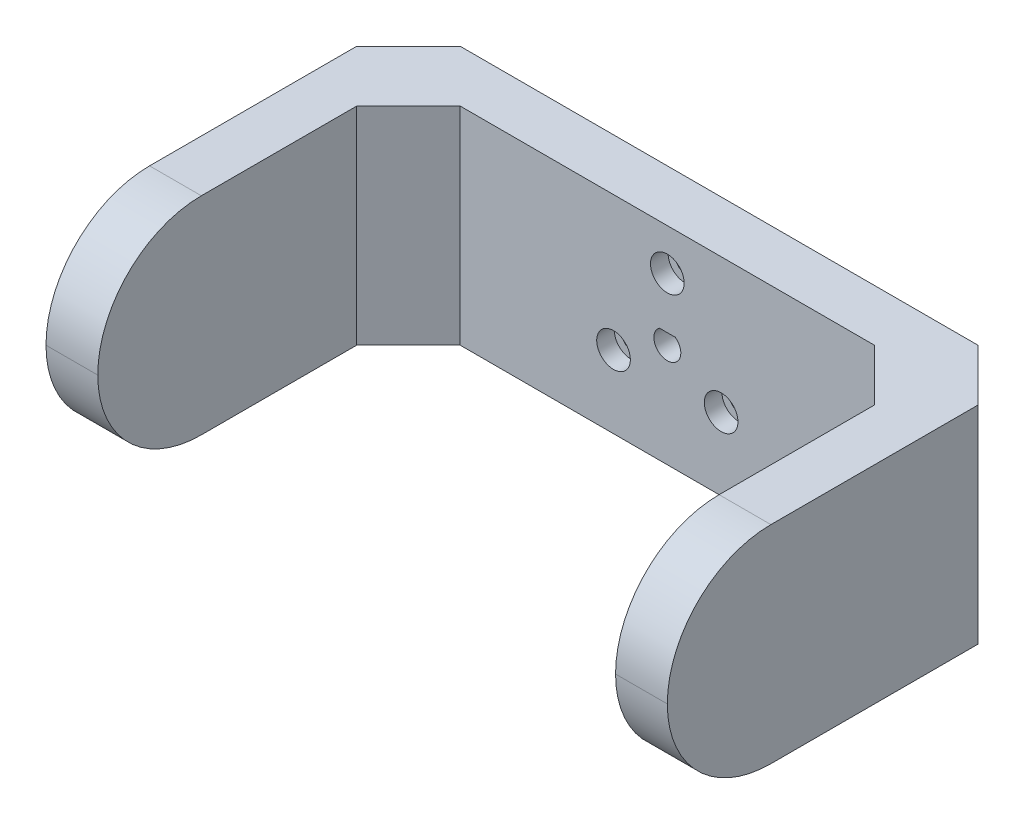
ISO-10303-21;
HEADER;
FILE_DESCRIPTION(('STEP AP214'),'2;1');
FILE_NAME('part.step','',(''),(''),'','','');
FILE_SCHEMA(('AUTOMOTIVE_DESIGN { 1 0 10303 214 1 1 1 1 }'));
ENDSEC;
DATA;
#1=APPLICATION_CONTEXT('core data for automotive mechanical design processes');
#2=APPLICATION_PROTOCOL_DEFINITION('international standard','automotive_design',2000,#1);
#3=PRODUCT_CONTEXT('',#1,'mechanical');
#4=PRODUCT('Part','Part','',(#3));
#5=PRODUCT_RELATED_PRODUCT_CATEGORY('part','',(#4));
#6=PRODUCT_DEFINITION_FORMATION('','',#4);
#7=PRODUCT_DEFINITION_CONTEXT('part definition',#1,'design');
#8=PRODUCT_DEFINITION('design','',#6,#7);
#9=PRODUCT_DEFINITION_SHAPE('','',#8);
#10=(LENGTH_UNIT() NAMED_UNIT(*) SI_UNIT(.MILLI.,.METRE.));
#11=(NAMED_UNIT(*) PLANE_ANGLE_UNIT() SI_UNIT($,.RADIAN.));
#12=(NAMED_UNIT(*) SI_UNIT($,.STERADIAN.) SOLID_ANGLE_UNIT());
#13=UNCERTAINTY_MEASURE_WITH_UNIT(LENGTH_MEASURE(1.E-05),#10,'distance_accuracy_value','');
#14=(GEOMETRIC_REPRESENTATION_CONTEXT(3) GLOBAL_UNCERTAINTY_ASSIGNED_CONTEXT((#13)) GLOBAL_UNIT_ASSIGNED_CONTEXT((#10,
#11,#12)) REPRESENTATION_CONTEXT('',''));
#15=CARTESIAN_POINT('',(0.,0.,0.));
#16=DIRECTION('',(0.,0.,1.));
#17=DIRECTION('',(1.,0.,0.));
#18=AXIS2_PLACEMENT_3D('',#15,#16,#17);
#19=CARTESIAN_POINT('',(-60.,20.,0.));
#20=DIRECTION('',(1.,0.,0.));
#21=DIRECTION('',(0.,0.,-1.));
#22=AXIS2_PLACEMENT_3D('',#19,#20,#21);
#23=PLANE('',#22);
#24=DIRECTION('',(0.,0.,1.));
#25=VECTOR('',#24,1.);
#26=CARTESIAN_POINT('',(-60.,-20.,0.));
#27=LINE('',#26,#25);
#28=CARTESIAN_POINT('',(-60.,-20.,9.99999999999996));
#29=VERTEX_POINT('',#28);
#30=CARTESIAN_POINT('',(-60.,-20.,50.));
#31=VERTEX_POINT('',#30);
#32=EDGE_CURVE('E187',#29,#31,#27,.T.);
#33=ORIENTED_EDGE('',*,*,#32,.T.);
#34=CARTESIAN_POINT('',(-60.,0.,50.));
#35=DIRECTION('',(1.,0.,0.));
#36=DIRECTION('',(0.,0.,-1.));
#37=AXIS2_PLACEMENT_3D('',#34,#35,#36);
#38=CIRCLE('',#37,20.);
#39=CARTESIAN_POINT('',(-60.,0.,70.));
#40=VERTEX_POINT('',#39);
#41=EDGE_CURVE('E269',#31,#40,#38,.F.);
#42=ORIENTED_EDGE('',*,*,#41,.T.);
#43=CARTESIAN_POINT('',(-60.,0.,50.));
#44=DIRECTION('',(1.,0.,0.));
#45=DIRECTION('',(0.,0.,-1.));
#46=AXIS2_PLACEMENT_3D('',#43,#44,#45);
#47=CIRCLE('',#46,20.);
#48=CARTESIAN_POINT('',(-60.,20.,50.));
#49=VERTEX_POINT('',#48);
#50=EDGE_CURVE('E267',#40,#49,#47,.F.);
#51=ORIENTED_EDGE('',*,*,#50,.T.);
#52=DIRECTION('',(0.,0.,1.));
#53=VECTOR('',#52,1.);
#54=CARTESIAN_POINT('',(-60.,20.,0.));
#55=LINE('',#54,#53);
#56=CARTESIAN_POINT('',(-60.,20.,9.99999999999996));
#57=VERTEX_POINT('',#56);
#58=EDGE_CURVE('E188',#57,#49,#55,.T.);
#59=ORIENTED_EDGE('',*,*,#58,.F.);
#60=DIRECTION('',(0.,-1.,0.));
#61=VECTOR('',#60,1.);
#62=CARTESIAN_POINT('',(-60.,20.,9.99999999999996));
#63=LINE('',#62,#61);
#64=EDGE_CURVE('E243',#57,#29,#63,.T.);
#65=ORIENTED_EDGE('',*,*,#64,.T.);
#66=EDGE_LOOP('',(#33,#42,#51,#59,#65));
#67=FACE_BOUND('',#66,.T.);
#68=ADVANCED_FACE('F43',(#67),#23,.F.);
#69=CARTESIAN_POINT('',(-50.,20.,70.));
#70=DIRECTION('',(-1.,0.,0.));
#71=DIRECTION('',(0.,0.,1.));
#72=AXIS2_PLACEMENT_3D('',#69,#70,#71);
#73=PLANE('',#72);
#74=CARTESIAN_POINT('',(-50.,0.,50.));
#75=DIRECTION('',(-1.,0.,0.));
#76=DIRECTION('',(0.,0.,1.));
#77=AXIS2_PLACEMENT_3D('',#74,#75,#76);
#78=CIRCLE('',#77,20.);
#79=CARTESIAN_POINT('',(-50.,20.,50.));
#80=VERTEX_POINT('',#79);
#81=CARTESIAN_POINT('',(-50.,0.,70.));
#82=VERTEX_POINT('',#81);
#83=EDGE_CURVE('E258',#80,#82,#78,.F.);
#84=ORIENTED_EDGE('',*,*,#83,.T.);
#85=CARTESIAN_POINT('',(-50.,0.,50.));
#86=DIRECTION('',(-1.,0.,0.));
#87=DIRECTION('',(0.,0.,1.));
#88=AXIS2_PLACEMENT_3D('',#85,#86,#87);
#89=CIRCLE('',#88,20.);
#90=CARTESIAN_POINT('',(-50.,-20.,50.));
#91=VERTEX_POINT('',#90);
#92=EDGE_CURVE('E260',#82,#91,#89,.F.);
#93=ORIENTED_EDGE('',*,*,#92,.T.);
#94=DIRECTION('',(0.,0.,-1.));
#95=VECTOR('',#94,1.);
#96=CARTESIAN_POINT('',(-50.,-20.,70.));
#97=LINE('',#96,#95);
#98=CARTESIAN_POINT('',(-50.,-20.,20.));
#99=VERTEX_POINT('',#98);
#100=EDGE_CURVE('E208',#91,#99,#97,.T.);
#101=ORIENTED_EDGE('',*,*,#100,.T.);
#102=DIRECTION('',(0.,1.,0.));
#103=VECTOR('',#102,1.);
#104=CARTESIAN_POINT('',(-50.,20.,20.));
#105=LINE('',#104,#103);
#106=CARTESIAN_POINT('',(-50.,20.,20.));
#107=VERTEX_POINT('',#106);
#108=EDGE_CURVE('E246',#99,#107,#105,.T.);
#109=ORIENTED_EDGE('',*,*,#108,.T.);
#110=DIRECTION('',(0.,0.,-1.));
#111=VECTOR('',#110,1.);
#112=CARTESIAN_POINT('',(-50.,20.,70.));
#113=LINE('',#112,#111);
#114=EDGE_CURVE('E191',#80,#107,#113,.T.);
#115=ORIENTED_EDGE('',*,*,#114,.F.);
#116=EDGE_LOOP('',(#84,#93,#101,#109,#115));
#117=FACE_BOUND('',#116,.T.);
#118=ADVANCED_FACE('F328',(#117),#73,.F.);
#119=CARTESIAN_POINT('',(-50.,20.,10.));
#120=DIRECTION('',(0.,0.,-1.));
#121=DIRECTION('',(-1.,0.,0.));
#122=AXIS2_PLACEMENT_3D('',#119,#120,#121);
#123=PLANE('',#122);
#124=CARTESIAN_POINT('',(10.3923048454131,-5.99999999999967,9.99999999999999));
#125=DIRECTION('',(0.,0.,1.));
#126=DIRECTION('',(-0.500000000000004,-0.866025403784436,0.));
#127=AXIS2_PLACEMENT_3D('',#124,#125,#126);
#128=CIRCLE('',#127,3.25);
#129=CARTESIAN_POINT('',(8.76730484541312,-8.81458256229909,9.99999999999999));
#130=VERTEX_POINT('',#129);
#131=EDGE_CURVE('E607',#130,#130,#128,.T.);
#132=ORIENTED_EDGE('',*,*,#131,.F.);
#133=EDGE_LOOP('',(#132));
#134=FACE_BOUND('',#133,.T.);
#135=CARTESIAN_POINT('',(-10.3923048454129,-6.,9.99999999999999));
#136=DIRECTION('',(0.,0.,1.));
#137=DIRECTION('',(-0.499999999999992,0.866025403784443,0.));
#138=AXIS2_PLACEMENT_3D('',#135,#136,#137);
#139=CIRCLE('',#138,3.25);
#140=CARTESIAN_POINT('',(-12.0173048454129,-3.18541743770056,9.99999999999999));
#141=VERTEX_POINT('',#140);
#142=EDGE_CURVE('E601',#141,#141,#139,.T.);
#143=ORIENTED_EDGE('',*,*,#142,.F.);
#144=EDGE_LOOP('',(#143));
#145=FACE_BOUND('',#144,.T.);
#146=CARTESIAN_POINT('',(-2.75821032680312E-13,11.9999999999997,9.99999999999999));
#147=DIRECTION('',(0.,0.,1.));
#148=DIRECTION('',(1.,0.,0.));
#149=AXIS2_PLACEMENT_3D('',#146,#147,#148);
#150=CIRCLE('',#149,3.25);
#151=CARTESIAN_POINT('',(3.24999999999972,11.9999999999997,9.99999999999999));
#152=VERTEX_POINT('',#151);
#153=EDGE_CURVE('E181',#152,#152,#150,.T.);
#154=ORIENTED_EDGE('',*,*,#153,.F.);
#155=EDGE_LOOP('',(#154));
#156=FACE_BOUND('',#155,.T.);
#157=DIRECTION('',(1.,0.,0.));
#158=VECTOR('',#157,1.);
#159=CARTESIAN_POINT('',(-50.,2.09999999999972,10.));
#160=LINE('',#159,#158);
#161=CARTESIAN_POINT('',(-1.53297097167531,2.09999999999972,9.99999999999999));
#162=VERTEX_POINT('',#161);
#163=CARTESIAN_POINT('',(1.53297097167531,2.09999999999972,9.99999999999999));
#164=VERTEX_POINT('',#163);
#165=EDGE_CURVE('E167',#162,#164,#160,.T.);
#166=ORIENTED_EDGE('',*,*,#165,.T.);
#167=CARTESIAN_POINT('',(-2.75821032680312E-13,-2.80157841370254E-13,9.99999999999999));
#168=DIRECTION('',(0.,0.,-1.));
#169=DIRECTION('',(-1.,0.,0.));
#170=AXIS2_PLACEMENT_3D('',#167,#168,#169);
#171=CIRCLE('',#170,2.59999999999984);
#172=EDGE_CURVE('E164',#164,#162,#171,.T.);
#173=ORIENTED_EDGE('',*,*,#172,.T.);
#174=EDGE_LOOP('',(#166,#173));
#175=FACE_BOUND('',#174,.T.);
#176=DIRECTION('',(1.,0.,0.));
#177=VECTOR('',#176,1.);
#178=CARTESIAN_POINT('',(-50.,-20.,10.));
#179=LINE('',#178,#177);
#180=CARTESIAN_POINT('',(-39.9999999999999,-20.,10.));
#181=VERTEX_POINT('',#180);
#182=CARTESIAN_POINT('',(40.,-20.,9.99999999999999));
#183=VERTEX_POINT('',#182);
#184=EDGE_CURVE('E210',#181,#183,#179,.T.);
#185=ORIENTED_EDGE('',*,*,#184,.T.);
#186=DIRECTION('',(0.,1.,0.));
#187=VECTOR('',#186,1.);
#188=CARTESIAN_POINT('',(40.,20.,9.99999999999999));
#189=LINE('',#188,#187);
#190=CARTESIAN_POINT('',(40.,20.,9.99999999999999));
#191=VERTEX_POINT('',#190);
#192=EDGE_CURVE('E241',#183,#191,#189,.T.);
#193=ORIENTED_EDGE('',*,*,#192,.T.);
#194=DIRECTION('',(1.,0.,0.));
#195=VECTOR('',#194,1.);
#196=CARTESIAN_POINT('',(-50.,20.,10.));
#197=LINE('',#196,#195);
#198=CARTESIAN_POINT('',(-39.9999999999999,20.,10.));
#199=VERTEX_POINT('',#198);
#200=EDGE_CURVE('E194',#199,#191,#197,.T.);
#201=ORIENTED_EDGE('',*,*,#200,.F.);
#202=DIRECTION('',(0.,-1.,0.));
#203=VECTOR('',#202,1.);
#204=CARTESIAN_POINT('',(-39.9999999999999,-20.,10.));
#205=LINE('',#204,#203);
#206=EDGE_CURVE('E238',#199,#181,#205,.T.);
#207=ORIENTED_EDGE('',*,*,#206,.T.);
#208=EDGE_LOOP('',(#185,#193,#201,#207));
#209=FACE_BOUND('',#208,.T.);
#210=ADVANCED_FACE('F307',(#134,#145,#156,#175,#209),#123,.F.);
#211=CARTESIAN_POINT('',(50.,20.,9.99999999999999));
#212=DIRECTION('',(1.,0.,0.));
#213=DIRECTION('',(0.,0.,-1.));
#214=AXIS2_PLACEMENT_3D('',#211,#212,#213);
#215=PLANE('',#214);
#216=CARTESIAN_POINT('',(50.,0.,50.));
#217=DIRECTION('',(1.,0.,0.));
#218=DIRECTION('',(0.,0.,-1.));
#219=AXIS2_PLACEMENT_3D('',#216,#217,#218);
#220=CIRCLE('',#219,20.);
#221=CARTESIAN_POINT('',(50.,-20.,50.));
#222=VERTEX_POINT('',#221);
#223=CARTESIAN_POINT('',(50.,0.,70.));
#224=VERTEX_POINT('',#223);
#225=EDGE_CURVE('E52',#222,#224,#220,.F.);
#226=ORIENTED_EDGE('',*,*,#225,.T.);
#227=CARTESIAN_POINT('',(50.,0.,50.));
#228=DIRECTION('',(1.,0.,0.));
#229=DIRECTION('',(0.,0.,-1.));
#230=AXIS2_PLACEMENT_3D('',#227,#228,#229);
#231=CIRCLE('',#230,20.);
#232=CARTESIAN_POINT('',(50.,20.,50.));
#233=VERTEX_POINT('',#232);
#234=EDGE_CURVE('E11',#224,#233,#231,.F.);
#235=ORIENTED_EDGE('',*,*,#234,.T.);
#236=DIRECTION('',(0.,0.,1.));
#237=VECTOR('',#236,1.);
#238=CARTESIAN_POINT('',(50.,20.,9.99999999999999));
#239=LINE('',#238,#237);
#240=CARTESIAN_POINT('',(50.,20.,20.0000000000001));
#241=VERTEX_POINT('',#240);
#242=EDGE_CURVE('E197',#241,#233,#239,.T.);
#243=ORIENTED_EDGE('',*,*,#242,.F.);
#244=DIRECTION('',(0.,-1.,0.));
#245=VECTOR('',#244,1.);
#246=CARTESIAN_POINT('',(50.,-20.,20.0000000000001));
#247=LINE('',#246,#245);
#248=CARTESIAN_POINT('',(50.,-20.,20.0000000000001));
#249=VERTEX_POINT('',#248);
#250=EDGE_CURVE('E235',#241,#249,#247,.T.);
#251=ORIENTED_EDGE('',*,*,#250,.T.);
#252=DIRECTION('',(0.,0.,1.));
#253=VECTOR('',#252,1.);
#254=CARTESIAN_POINT('',(50.,-20.,9.99999999999999));
#255=LINE('',#254,#253);
#256=EDGE_CURVE('E213',#249,#222,#255,.T.);
#257=ORIENTED_EDGE('',*,*,#256,.T.);
#258=EDGE_LOOP('',(#226,#235,#243,#251,#257));
#259=FACE_BOUND('',#258,.T.);
#260=ADVANCED_FACE('F296',(#259),#215,.F.);
#261=CARTESIAN_POINT('',(60.,20.,70.));
#262=DIRECTION('',(-1.,0.,0.));
#263=DIRECTION('',(0.,0.,1.));
#264=AXIS2_PLACEMENT_3D('',#261,#262,#263);
#265=PLANE('',#264);
#266=DIRECTION('',(0.,0.,-1.));
#267=VECTOR('',#266,1.);
#268=CARTESIAN_POINT('',(60.,20.,70.));
#269=LINE('',#268,#267);
#270=CARTESIAN_POINT('',(60.,20.,50.));
#271=VERTEX_POINT('',#270);
#272=CARTESIAN_POINT('',(60.,20.,10.));
#273=VERTEX_POINT('',#272);
#274=EDGE_CURVE('E200',#271,#273,#269,.T.);
#275=ORIENTED_EDGE('',*,*,#274,.F.);
#276=CARTESIAN_POINT('',(60.,0.,50.));
#277=DIRECTION('',(-1.,0.,0.));
#278=DIRECTION('',(0.,0.,1.));
#279=AXIS2_PLACEMENT_3D('',#276,#277,#278);
#280=CIRCLE('',#279,20.);
#281=CARTESIAN_POINT('',(60.,0.,70.));
#282=VERTEX_POINT('',#281);
#283=EDGE_CURVE('E66',#271,#282,#280,.F.);
#284=ORIENTED_EDGE('',*,*,#283,.T.);
#285=CARTESIAN_POINT('',(60.,0.,50.));
#286=DIRECTION('',(-1.,0.,0.));
#287=DIRECTION('',(0.,0.,1.));
#288=AXIS2_PLACEMENT_3D('',#285,#286,#287);
#289=CIRCLE('',#288,20.);
#290=CARTESIAN_POINT('',(60.,-20.,50.));
#291=VERTEX_POINT('',#290);
#292=EDGE_CURVE('E276',#282,#291,#289,.F.);
#293=ORIENTED_EDGE('',*,*,#292,.T.);
#294=DIRECTION('',(0.,0.,-1.));
#295=VECTOR('',#294,1.);
#296=CARTESIAN_POINT('',(60.,-20.,70.));
#297=LINE('',#296,#295);
#298=CARTESIAN_POINT('',(60.,-20.,10.));
#299=VERTEX_POINT('',#298);
#300=EDGE_CURVE('E215',#291,#299,#297,.T.);
#301=ORIENTED_EDGE('',*,*,#300,.T.);
#302=DIRECTION('',(0.,1.,0.));
#303=VECTOR('',#302,1.);
#304=CARTESIAN_POINT('',(60.,20.,10.));
#305=LINE('',#304,#303);
#306=EDGE_CURVE('E228',#299,#273,#305,.T.);
#307=ORIENTED_EDGE('',*,*,#306,.T.);
#308=EDGE_LOOP('',(#275,#284,#293,#301,#307));
#309=FACE_BOUND('',#308,.T.);
#310=ADVANCED_FACE('F280',(#309),#265,.F.);
#311=CARTESIAN_POINT('',(-60.,20.,0.));
#312=DIRECTION('',(0.,0.,1.));
#313=DIRECTION('',(1.,0.,0.));
#314=AXIS2_PLACEMENT_3D('',#311,#312,#313);
#315=PLANE('',#314);
#316=CARTESIAN_POINT('',(10.3923048454131,-5.99999999999967,0.));
#317=DIRECTION('',(0.,0.,1.));
#318=DIRECTION('',(1.,0.,0.));
#319=AXIS2_PLACEMENT_3D('',#316,#317,#318);
#320=CIRCLE('',#319,1.7);
#321=CARTESIAN_POINT('',(12.0923048454131,-5.99999999999967,0.));
#322=VERTEX_POINT('',#321);
#323=EDGE_CURVE('E579',#322,#322,#320,.F.);
#324=ORIENTED_EDGE('',*,*,#323,.F.);
#325=EDGE_LOOP('',(#324));
#326=FACE_BOUND('',#325,.T.);
#327=CARTESIAN_POINT('',(-10.3923048454129,-6.,0.));
#328=DIRECTION('',(0.,0.,1.));
#329=DIRECTION('',(1.,0.,0.));
#330=AXIS2_PLACEMENT_3D('',#327,#328,#329);
#331=CIRCLE('',#330,1.7);
#332=CARTESIAN_POINT('',(-8.69230484541294,-6.,0.));
#333=VERTEX_POINT('',#332);
#334=EDGE_CURVE('E583',#333,#333,#331,.F.);
#335=ORIENTED_EDGE('',*,*,#334,.F.);
#336=EDGE_LOOP('',(#335));
#337=FACE_BOUND('',#336,.T.);
#338=CARTESIAN_POINT('',(-2.75821032680312E-13,11.9999999999997,0.));
#339=DIRECTION('',(0.,0.,1.));
#340=DIRECTION('',(1.,0.,0.));
#341=AXIS2_PLACEMENT_3D('',#338,#339,#340);
#342=CIRCLE('',#341,1.7);
#343=CARTESIAN_POINT('',(1.69999999999972,11.9999999999997,0.));
#344=VERTEX_POINT('',#343);
#345=EDGE_CURVE('E586',#344,#344,#342,.F.);
#346=ORIENTED_EDGE('',*,*,#345,.F.);
#347=EDGE_LOOP('',(#346));
#348=FACE_BOUND('',#347,.T.);
#349=DIRECTION('',(1.,0.,0.));
#350=VECTOR('',#349,1.);
#351=CARTESIAN_POINT('',(1.53297097167531,2.09999999999972,0.));
#352=LINE('',#351,#350);
#353=CARTESIAN_POINT('',(-1.53297097167531,2.09999999999972,0.));
#354=VERTEX_POINT('',#353);
#355=CARTESIAN_POINT('',(1.53297097167531,2.09999999999972,0.));
#356=VERTEX_POINT('',#355);
#357=EDGE_CURVE('E171',#354,#356,#352,.T.);
#358=ORIENTED_EDGE('',*,*,#357,.F.);
#359=CARTESIAN_POINT('',(-2.75821032680312E-13,-2.80157841370254E-13,0.));
#360=DIRECTION('',(0.,0.,-1.));
#361=DIRECTION('',(-1.,0.,0.));
#362=AXIS2_PLACEMENT_3D('',#359,#360,#361);
#363=CIRCLE('',#362,2.59999999999984);
#364=EDGE_CURVE('E161',#356,#354,#363,.T.);
#365=ORIENTED_EDGE('',*,*,#364,.F.);
#366=EDGE_LOOP('',(#358,#365));
#367=FACE_BOUND('',#366,.T.);
#368=DIRECTION('',(-1.,0.,0.));
#369=VECTOR('',#368,1.);
#370=CARTESIAN_POINT('',(-60.,20.,0.));
#371=LINE('',#370,#369);
#372=CARTESIAN_POINT('',(50.,20.,0.));
#373=VERTEX_POINT('',#372);
#374=CARTESIAN_POINT('',(-50.,20.,0.));
#375=VERTEX_POINT('',#374);
#376=EDGE_CURVE('E202',#373,#375,#371,.T.);
#377=ORIENTED_EDGE('',*,*,#376,.F.);
#378=DIRECTION('',(0.,-1.,0.));
#379=VECTOR('',#378,1.);
#380=CARTESIAN_POINT('',(50.,20.,0.));
#381=LINE('',#380,#379);
#382=CARTESIAN_POINT('',(50.,-20.,0.));
#383=VERTEX_POINT('',#382);
#384=EDGE_CURVE('E220',#373,#383,#381,.T.);
#385=ORIENTED_EDGE('',*,*,#384,.T.);
#386=DIRECTION('',(-1.,0.,0.));
#387=VECTOR('',#386,1.);
#388=CARTESIAN_POINT('',(-60.,-20.,0.));
#389=LINE('',#388,#387);
#390=CARTESIAN_POINT('',(-50.,-20.,0.));
#391=VERTEX_POINT('',#390);
#392=EDGE_CURVE('E192',#383,#391,#389,.T.);
#393=ORIENTED_EDGE('',*,*,#392,.T.);
#394=DIRECTION('',(0.,1.,0.));
#395=VECTOR('',#394,1.);
#396=CARTESIAN_POINT('',(-50.,20.,0.));
#397=LINE('',#396,#395);
#398=EDGE_CURVE('E205',#391,#375,#397,.T.);
#399=ORIENTED_EDGE('',*,*,#398,.T.);
#400=EDGE_LOOP('',(#377,#385,#393,#399));
#401=FACE_BOUND('',#400,.T.);
#402=ADVANCED_FACE('F175',(#326,#337,#348,#367,#401),#315,.F.);
#403=CARTESIAN_POINT('',(0.,20.,0.));
#404=DIRECTION('',(0.,1.,0.));
#405=DIRECTION('',(0.,0.,1.));
#406=AXIS2_PLACEMENT_3D('',#403,#404,#405);
#407=PLANE('',#406);
#408=ORIENTED_EDGE('',*,*,#58,.T.);
#409=DIRECTION('',(1.,0.,0.));
#410=VECTOR('',#409,1.);
#411=CARTESIAN_POINT('',(-50.,20.,50.));
#412=LINE('',#411,#410);
#413=EDGE_CURVE('E274',#49,#80,#412,.T.);
#414=ORIENTED_EDGE('',*,*,#413,.T.);
#415=ORIENTED_EDGE('',*,*,#114,.T.);
#416=DIRECTION('',(-0.707106781186551,0.,0.707106781186544));
#417=VECTOR('',#416,1.);
#418=CARTESIAN_POINT('',(-39.9999999999999,20.,10.));
#419=LINE('',#418,#417);
#420=EDGE_CURVE('E256',#107,#199,#419,.F.);
#421=ORIENTED_EDGE('',*,*,#420,.T.);
#422=ORIENTED_EDGE('',*,*,#200,.T.);
#423=DIRECTION('',(-0.707106781186544,0.,-0.707106781186551));
#424=VECTOR('',#423,1.);
#425=CARTESIAN_POINT('',(50.,20.,20.0000000000001));
#426=LINE('',#425,#424);
#427=EDGE_CURVE('E251',#191,#241,#426,.F.);
#428=ORIENTED_EDGE('',*,*,#427,.T.);
#429=ORIENTED_EDGE('',*,*,#242,.T.);
#430=DIRECTION('',(1.,0.,0.));
#431=VECTOR('',#430,1.);
#432=CARTESIAN_POINT('',(60.,20.,50.));
#433=LINE('',#432,#431);
#434=EDGE_CURVE('E271',#233,#271,#433,.T.);
#435=ORIENTED_EDGE('',*,*,#434,.T.);
#436=ORIENTED_EDGE('',*,*,#274,.T.);
#437=DIRECTION('',(0.707106781186547,0.,0.707106781186549));
#438=VECTOR('',#437,1.);
#439=CARTESIAN_POINT('',(25.0000000000001,20.,-25.));
#440=LINE('',#439,#438);
#441=EDGE_CURVE('E233',#273,#373,#440,.F.);
#442=ORIENTED_EDGE('',*,*,#441,.T.);
#443=ORIENTED_EDGE('',*,*,#376,.T.);
#444=DIRECTION('',(0.707106781186549,0.,-0.707106781186547));
#445=VECTOR('',#444,1.);
#446=CARTESIAN_POINT('',(-24.9999999999999,20.,-25.));
#447=LINE('',#446,#445);
#448=EDGE_CURVE('E231',#375,#57,#447,.F.);
#449=ORIENTED_EDGE('',*,*,#448,.T.);
#450=EDGE_LOOP('',(#408,#414,#415,#421,#422,#428,#429,#435,#436,#442,#443,#449));
#451=FACE_BOUND('',#450,.T.);
#452=ADVANCED_FACE('F299',(#451),#407,.T.);
#453=CARTESIAN_POINT('',(0.,-20.,0.));
#454=DIRECTION('',(0.,1.,0.));
#455=DIRECTION('',(0.,0.,1.));
#456=AXIS2_PLACEMENT_3D('',#453,#454,#455);
#457=PLANE('',#456);
#458=ORIENTED_EDGE('',*,*,#100,.F.);
#459=DIRECTION('',(1.,0.,0.));
#460=VECTOR('',#459,1.);
#461=CARTESIAN_POINT('',(0.,-20.,50.));
#462=LINE('',#461,#460);
#463=EDGE_CURVE('E264',#91,#31,#462,.F.);
#464=ORIENTED_EDGE('',*,*,#463,.T.);
#465=ORIENTED_EDGE('',*,*,#32,.F.);
#466=DIRECTION('',(-0.707106781186549,0.,0.707106781186547));
#467=VECTOR('',#466,1.);
#468=CARTESIAN_POINT('',(-60.,-20.,9.99999999999997));
#469=LINE('',#468,#467);
#470=EDGE_CURVE('E223',#29,#391,#469,.F.);
#471=ORIENTED_EDGE('',*,*,#470,.T.);
#472=ORIENTED_EDGE('',*,*,#392,.F.);
#473=DIRECTION('',(-0.707106781186547,0.,-0.707106781186549));
#474=VECTOR('',#473,1.);
#475=CARTESIAN_POINT('',(50.,-20.,0.));
#476=LINE('',#475,#474);
#477=EDGE_CURVE('E225',#383,#299,#476,.F.);
#478=ORIENTED_EDGE('',*,*,#477,.T.);
#479=ORIENTED_EDGE('',*,*,#300,.F.);
#480=DIRECTION('',(1.,0.,0.));
#481=VECTOR('',#480,1.);
#482=CARTESIAN_POINT('',(0.,-20.,50.));
#483=LINE('',#482,#481);
#484=EDGE_CURVE('E262',#291,#222,#483,.F.);
#485=ORIENTED_EDGE('',*,*,#484,.T.);
#486=ORIENTED_EDGE('',*,*,#256,.F.);
#487=DIRECTION('',(0.707106781186544,0.,0.707106781186551));
#488=VECTOR('',#487,1.);
#489=CARTESIAN_POINT('',(15.0000000000002,-20.,-15.0000000000001));
#490=LINE('',#489,#488);
#491=EDGE_CURVE('E249',#249,#183,#490,.F.);
#492=ORIENTED_EDGE('',*,*,#491,.T.);
#493=ORIENTED_EDGE('',*,*,#184,.F.);
#494=DIRECTION('',(0.707106781186551,0.,-0.707106781186544));
#495=VECTOR('',#494,1.);
#496=CARTESIAN_POINT('',(-14.9999999999997,-20.,-14.9999999999999));
#497=LINE('',#496,#495);
#498=EDGE_CURVE('E253',#181,#99,#497,.F.);
#499=ORIENTED_EDGE('',*,*,#498,.T.);
#500=EDGE_LOOP('',(#458,#464,#465,#471,#472,#478,#479,#485,#486,#492,#493,#499));
#501=FACE_BOUND('',#500,.T.);
#502=ADVANCED_FACE('F286',(#501),#457,.F.);
#503=CARTESIAN_POINT('',(-2.75821032680312E-13,-2.80157841370254E-13,20.));
#504=DIRECTION('',(0.,0.,-1.));
#505=DIRECTION('',(-1.,0.,0.));
#506=AXIS2_PLACEMENT_3D('',#503,#504,#505);
#507=CYLINDRICAL_SURFACE('',#506,2.59999999999984);
#508=DIRECTION('',(0.,0.,-1.));
#509=VECTOR('',#508,1.);
#510=CARTESIAN_POINT('',(1.53297097167531,2.09999999999972,20.));
#511=LINE('',#510,#509);
#512=EDGE_CURVE('E156',#164,#356,#511,.T.);
#513=ORIENTED_EDGE('',*,*,#512,.T.);
#514=ORIENTED_EDGE('',*,*,#364,.T.);
#515=DIRECTION('',(0.,0.,-1.));
#516=VECTOR('',#515,1.);
#517=CARTESIAN_POINT('',(-1.53297097167531,2.09999999999972,20.));
#518=LINE('',#517,#516);
#519=EDGE_CURVE('E168',#162,#354,#518,.T.);
#520=ORIENTED_EDGE('',*,*,#519,.F.);
#521=ORIENTED_EDGE('',*,*,#172,.F.);
#522=EDGE_LOOP('',(#513,#514,#520,#521));
#523=FACE_BOUND('',#522,.T.);
#524=ADVANCED_FACE('F158',(#523),#507,.F.);
#525=CARTESIAN_POINT('',(1.53297097167531,2.09999999999972,20.));
#526=DIRECTION('',(0.,1.,0.));
#527=DIRECTION('',(0.,0.,1.));
#528=AXIS2_PLACEMENT_3D('',#525,#526,#527);
#529=PLANE('',#528);
#530=ORIENTED_EDGE('',*,*,#519,.T.);
#531=ORIENTED_EDGE('',*,*,#357,.T.);
#532=ORIENTED_EDGE('',*,*,#512,.F.);
#533=ORIENTED_EDGE('',*,*,#165,.F.);
#534=EDGE_LOOP('',(#530,#531,#532,#533));
#535=FACE_BOUND('',#534,.T.);
#536=ADVANCED_FACE('F172',(#535),#529,.F.);
#537=CARTESIAN_POINT('',(50.,20.,0.));
#538=DIRECTION('',(-0.707106781186549,0.,0.707106781186547));
#539=DIRECTION('',(0.,-1.,0.));
#540=AXIS2_PLACEMENT_3D('',#537,#538,#539);
#541=PLANE('',#540);
#542=ORIENTED_EDGE('',*,*,#441,.F.);
#543=ORIENTED_EDGE('',*,*,#306,.F.);
#544=ORIENTED_EDGE('',*,*,#477,.F.);
#545=ORIENTED_EDGE('',*,*,#384,.F.);
#546=EDGE_LOOP('',(#542,#543,#544,#545));
#547=FACE_BOUND('',#546,.T.);
#548=ADVANCED_FACE('F342',(#547),#541,.F.);
#549=CARTESIAN_POINT('',(50.,20.,20.0000000000001));
#550=DIRECTION('',(-0.707106781186551,0.,0.707106781186544));
#551=DIRECTION('',(0.,1.,0.));
#552=AXIS2_PLACEMENT_3D('',#549,#550,#551);
#553=PLANE('',#552);
#554=ORIENTED_EDGE('',*,*,#427,.F.);
#555=ORIENTED_EDGE('',*,*,#192,.F.);
#556=ORIENTED_EDGE('',*,*,#491,.F.);
#557=ORIENTED_EDGE('',*,*,#250,.F.);
#558=EDGE_LOOP('',(#554,#555,#556,#557));
#559=FACE_BOUND('',#558,.T.);
#560=ADVANCED_FACE('F304',(#559),#553,.T.);
#561=CARTESIAN_POINT('',(-60.,20.,9.99999999999997));
#562=DIRECTION('',(0.707106781186547,0.,0.707106781186549));
#563=DIRECTION('',(0.,-1.,0.));
#564=AXIS2_PLACEMENT_3D('',#561,#562,#563);
#565=PLANE('',#564);
#566=ORIENTED_EDGE('',*,*,#448,.F.);
#567=ORIENTED_EDGE('',*,*,#398,.F.);
#568=ORIENTED_EDGE('',*,*,#470,.F.);
#569=ORIENTED_EDGE('',*,*,#64,.F.);
#570=EDGE_LOOP('',(#566,#567,#568,#569));
#571=FACE_BOUND('',#570,.T.);
#572=ADVANCED_FACE('F354',(#571),#565,.F.);
#573=CARTESIAN_POINT('',(-39.9999999999999,20.,10.));
#574=DIRECTION('',(0.707106781186544,0.,0.707106781186551));
#575=DIRECTION('',(0.,1.,0.));
#576=AXIS2_PLACEMENT_3D('',#573,#574,#575);
#577=PLANE('',#576);
#578=ORIENTED_EDGE('',*,*,#420,.F.);
#579=ORIENTED_EDGE('',*,*,#108,.F.);
#580=ORIENTED_EDGE('',*,*,#498,.F.);
#581=ORIENTED_EDGE('',*,*,#206,.F.);
#582=EDGE_LOOP('',(#578,#579,#580,#581));
#583=FACE_BOUND('',#582,.T.);
#584=ADVANCED_FACE('F311',(#583),#577,.T.);
#585=CARTESIAN_POINT('',(0.,0.,50.));
#586=DIRECTION('',(-1.,0.,0.));
#587=DIRECTION('',(0.,0.,1.));
#588=AXIS2_PLACEMENT_3D('',#585,#586,#587);
#589=CYLINDRICAL_SURFACE('',#588,20.);
#590=ORIENTED_EDGE('',*,*,#413,.F.);
#591=ORIENTED_EDGE('',*,*,#50,.F.);
#592=DIRECTION('',(1.,0.,0.));
#593=VECTOR('',#592,1.);
#594=CARTESIAN_POINT('',(-60.,0.,70.));
#595=LINE('',#594,#593);
#596=EDGE_CURVE('E177',#82,#40,#595,.F.);
#597=ORIENTED_EDGE('',*,*,#596,.F.);
#598=ORIENTED_EDGE('',*,*,#83,.F.);
#599=EDGE_LOOP('',(#590,#591,#597,#598));
#600=FACE_BOUND('',#599,.T.);
#601=ADVANCED_FACE('F325',(#600),#589,.T.);
#602=CARTESIAN_POINT('',(-60.,0.,50.));
#603=DIRECTION('',(1.,0.,0.));
#604=DIRECTION('',(0.,0.,-1.));
#605=AXIS2_PLACEMENT_3D('',#602,#603,#604);
#606=CYLINDRICAL_SURFACE('',#605,20.);
#607=ORIENTED_EDGE('',*,*,#41,.F.);
#608=ORIENTED_EDGE('',*,*,#463,.F.);
#609=ORIENTED_EDGE('',*,*,#92,.F.);
#610=ORIENTED_EDGE('',*,*,#596,.T.);
#611=EDGE_LOOP('',(#607,#608,#609,#610));
#612=FACE_BOUND('',#611,.T.);
#613=ADVANCED_FACE('F318',(#612),#606,.T.);
#614=CARTESIAN_POINT('',(50.,0.,50.));
#615=DIRECTION('',(1.,0.,0.));
#616=DIRECTION('',(0.,0.,-1.));
#617=AXIS2_PLACEMENT_3D('',#614,#615,#616);
#618=CYLINDRICAL_SURFACE('',#617,20.);
#619=DIRECTION('',(1.,0.,0.));
#620=VECTOR('',#619,1.);
#621=CARTESIAN_POINT('',(50.,0.,70.));
#622=LINE('',#621,#620);
#623=EDGE_CURVE('E47',#224,#282,#622,.T.);
#624=ORIENTED_EDGE('',*,*,#623,.F.);
#625=ORIENTED_EDGE('',*,*,#225,.F.);
#626=ORIENTED_EDGE('',*,*,#484,.F.);
#627=ORIENTED_EDGE('',*,*,#292,.F.);
#628=EDGE_LOOP('',(#624,#625,#626,#627));
#629=FACE_BOUND('',#628,.T.);
#630=ADVANCED_FACE('F45',(#629),#618,.T.);
#631=CARTESIAN_POINT('',(0.,0.,50.));
#632=DIRECTION('',(-1.,0.,0.));
#633=DIRECTION('',(0.,0.,1.));
#634=AXIS2_PLACEMENT_3D('',#631,#632,#633);
#635=CYLINDRICAL_SURFACE('',#634,20.);
#636=ORIENTED_EDGE('',*,*,#234,.F.);
#637=ORIENTED_EDGE('',*,*,#623,.T.);
#638=ORIENTED_EDGE('',*,*,#283,.F.);
#639=ORIENTED_EDGE('',*,*,#434,.F.);
#640=EDGE_LOOP('',(#636,#637,#638,#639));
#641=FACE_BOUND('',#640,.T.);
#642=ADVANCED_FACE('F294',(#641),#635,.T.);
#643=CARTESIAN_POINT('',(-2.75821032680312E-13,11.9999999999997,6.59999999999999));
#644=DIRECTION('',(0.,0.,1.));
#645=DIRECTION('',(1.,0.,0.));
#646=AXIS2_PLACEMENT_3D('',#643,#644,#645);
#647=CYLINDRICAL_SURFACE('',#646,3.25);
#648=CARTESIAN_POINT('',(-2.75821032680312E-13,11.9999999999997,6.59999999999999));
#649=DIRECTION('',(0.,0.,1.));
#650=DIRECTION('',(1.,0.,0.));
#651=AXIS2_PLACEMENT_3D('',#648,#649,#650);
#652=CIRCLE('',#651,3.25);
#653=CARTESIAN_POINT('',(3.24999999999972,11.9999999999997,6.59999999999999));
#654=VERTEX_POINT('',#653);
#655=EDGE_CURVE('E292',#654,#654,#652,.T.);
#656=ORIENTED_EDGE('',*,*,#655,.F.);
#657=EDGE_LOOP('',(#656));
#658=FACE_BOUND('',#657,.T.);
#659=ORIENTED_EDGE('',*,*,#153,.T.);
#660=EDGE_LOOP('',(#659));
#661=FACE_BOUND('',#660,.T.);
#662=ADVANCED_FACE('F369',(#658,#661),#647,.F.);
#663=CARTESIAN_POINT('',(-2.75821032680312E-13,11.9999999999997,6.59999999999999));
#664=DIRECTION('',(0.,0.,1.));
#665=DIRECTION('',(1.,0.,0.));
#666=AXIS2_PLACEMENT_3D('',#663,#664,#665);
#667=PLANE('',#666);
#668=CARTESIAN_POINT('',(-2.75821032680312E-13,11.9999999999997,6.59999999999999));
#669=DIRECTION('',(0.,0.,1.));
#670=DIRECTION('',(1.,0.,0.));
#671=AXIS2_PLACEMENT_3D('',#668,#669,#670);
#672=CIRCLE('',#671,1.7);
#673=CARTESIAN_POINT('',(1.69999999999972,11.9999999999997,6.59999999999999));
#674=VERTEX_POINT('',#673);
#675=EDGE_CURVE('E587',#674,#674,#672,.T.);
#676=ORIENTED_EDGE('',*,*,#675,.F.);
#677=EDGE_LOOP('',(#676));
#678=FACE_BOUND('',#677,.T.);
#679=ORIENTED_EDGE('',*,*,#655,.T.);
#680=EDGE_LOOP('',(#679));
#681=FACE_BOUND('',#680,.T.);
#682=ADVANCED_FACE('F374',(#678,#681),#667,.T.);
#683=CARTESIAN_POINT('',(-2.75821032680312E-13,11.9999999999997,-4.80832611206853));
#684=DIRECTION('',(0.,0.,1.));
#685=DIRECTION('',(1.,0.,0.));
#686=AXIS2_PLACEMENT_3D('',#683,#684,#685);
#687=CYLINDRICAL_SURFACE('',#686,1.7);
#688=ORIENTED_EDGE('',*,*,#345,.T.);
#689=EDGE_LOOP('',(#688));
#690=FACE_BOUND('',#689,.T.);
#691=ORIENTED_EDGE('',*,*,#675,.T.);
#692=EDGE_LOOP('',(#691));
#693=FACE_BOUND('',#692,.T.);
#694=ADVANCED_FACE('F496',(#690,#693),#687,.F.);
#695=CARTESIAN_POINT('',(-10.3923048454129,-6.,6.59999999999999));
#696=DIRECTION('',(0.,0.,1.));
#697=DIRECTION('',(1.,0.,0.));
#698=AXIS2_PLACEMENT_3D('',#695,#696,#697);
#699=CYLINDRICAL_SURFACE('',#698,3.25);
#700=CARTESIAN_POINT('',(-10.3923048454129,-6.,6.59999999999999));
#701=DIRECTION('',(0.,0.,1.));
#702=DIRECTION('',(-0.499999999999992,0.866025403784443,0.));
#703=AXIS2_PLACEMENT_3D('',#700,#701,#702);
#704=CIRCLE('',#703,3.25);
#705=CARTESIAN_POINT('',(-12.0173048454129,-3.18541743770056,6.59999999999999));
#706=VERTEX_POINT('',#705);
#707=EDGE_CURVE('E604',#706,#706,#704,.T.);
#708=ORIENTED_EDGE('',*,*,#707,.F.);
#709=EDGE_LOOP('',(#708));
#710=FACE_BOUND('',#709,.T.);
#711=ORIENTED_EDGE('',*,*,#142,.T.);
#712=EDGE_LOOP('',(#711));
#713=FACE_BOUND('',#712,.T.);
#714=ADVANCED_FACE('F504',(#710,#713),#699,.F.);
#715=CARTESIAN_POINT('',(-10.3923048454129,-6.,6.59999999999999));
#716=DIRECTION('',(0.,0.,1.));
#717=DIRECTION('',(-0.499999999999992,0.866025403784443,0.));
#718=AXIS2_PLACEMENT_3D('',#715,#716,#717);
#719=PLANE('',#718);
#720=CARTESIAN_POINT('',(-10.3923048454129,-6.,6.59999999999999));
#721=DIRECTION('',(0.,0.,1.));
#722=DIRECTION('',(-0.499999999999992,0.866025403784443,0.));
#723=AXIS2_PLACEMENT_3D('',#720,#721,#722);
#724=CIRCLE('',#723,1.7);
#725=CARTESIAN_POINT('',(-11.2423048454129,-4.52775681356645,6.59999999999999));
#726=VERTEX_POINT('',#725);
#727=EDGE_CURVE('E614',#726,#726,#724,.T.);
#728=ORIENTED_EDGE('',*,*,#727,.F.);
#729=EDGE_LOOP('',(#728));
#730=FACE_BOUND('',#729,.T.);
#731=ORIENTED_EDGE('',*,*,#707,.T.);
#732=EDGE_LOOP('',(#731));
#733=FACE_BOUND('',#732,.T.);
#734=ADVANCED_FACE('F513',(#730,#733),#719,.T.);
#735=CARTESIAN_POINT('',(10.3923048454131,-5.99999999999967,6.59999999999999));
#736=DIRECTION('',(0.,0.,1.));
#737=DIRECTION('',(1.,0.,0.));
#738=AXIS2_PLACEMENT_3D('',#735,#736,#737);
#739=CYLINDRICAL_SURFACE('',#738,3.25);
#740=CARTESIAN_POINT('',(10.3923048454131,-5.99999999999967,6.59999999999999));
#741=DIRECTION('',(0.,0.,1.));
#742=DIRECTION('',(-0.500000000000004,-0.866025403784436,0.));
#743=AXIS2_PLACEMENT_3D('',#740,#741,#742);
#744=CIRCLE('',#743,3.25);
#745=CARTESIAN_POINT('',(8.76730484541312,-8.81458256229909,6.59999999999999));
#746=VERTEX_POINT('',#745);
#747=EDGE_CURVE('E591',#746,#746,#744,.T.);
#748=ORIENTED_EDGE('',*,*,#747,.F.);
#749=EDGE_LOOP('',(#748));
#750=FACE_BOUND('',#749,.T.);
#751=ORIENTED_EDGE('',*,*,#131,.T.);
#752=EDGE_LOOP('',(#751));
#753=FACE_BOUND('',#752,.T.);
#754=ADVANCED_FACE('F522',(#750,#753),#739,.F.);
#755=CARTESIAN_POINT('',(10.3923048454131,-5.99999999999967,6.59999999999999));
#756=DIRECTION('',(0.,0.,1.));
#757=DIRECTION('',(-0.500000000000004,-0.866025403784436,0.));
#758=AXIS2_PLACEMENT_3D('',#755,#756,#757);
#759=PLANE('',#758);
#760=CARTESIAN_POINT('',(10.3923048454131,-5.99999999999967,6.59999999999999));
#761=DIRECTION('',(0.,0.,1.));
#762=DIRECTION('',(-0.500000000000004,-0.866025403784436,0.));
#763=AXIS2_PLACEMENT_3D('',#760,#761,#762);
#764=CIRCLE('',#763,1.7);
#765=CARTESIAN_POINT('',(9.54230484541313,-7.47224318643321,6.59999999999999));
#766=VERTEX_POINT('',#765);
#767=EDGE_CURVE('E613',#766,#766,#764,.T.);
#768=ORIENTED_EDGE('',*,*,#767,.F.);
#769=EDGE_LOOP('',(#768));
#770=FACE_BOUND('',#769,.T.);
#771=ORIENTED_EDGE('',*,*,#747,.T.);
#772=EDGE_LOOP('',(#771));
#773=FACE_BOUND('',#772,.T.);
#774=ADVANCED_FACE('F531',(#770,#773),#759,.T.);
#775=CARTESIAN_POINT('',(-10.3923048454129,-6.,-4.80832611206853));
#776=DIRECTION('',(0.,0.,1.));
#777=DIRECTION('',(1.,0.,0.));
#778=AXIS2_PLACEMENT_3D('',#775,#776,#777);
#779=CYLINDRICAL_SURFACE('',#778,1.7);
#780=ORIENTED_EDGE('',*,*,#334,.T.);
#781=EDGE_LOOP('',(#780));
#782=FACE_BOUND('',#781,.T.);
#783=ORIENTED_EDGE('',*,*,#727,.T.);
#784=EDGE_LOOP('',(#783));
#785=FACE_BOUND('',#784,.T.);
#786=ADVANCED_FACE('F540',(#782,#785),#779,.F.);
#787=CARTESIAN_POINT('',(10.3923048454131,-5.99999999999967,-4.80832611206853));
#788=DIRECTION('',(0.,0.,1.));
#789=DIRECTION('',(1.,0.,0.));
#790=AXIS2_PLACEMENT_3D('',#787,#788,#789);
#791=CYLINDRICAL_SURFACE('',#790,1.7);
#792=ORIENTED_EDGE('',*,*,#323,.T.);
#793=EDGE_LOOP('',(#792));
#794=FACE_BOUND('',#793,.T.);
#795=ORIENTED_EDGE('',*,*,#767,.T.);
#796=EDGE_LOOP('',(#795));
#797=FACE_BOUND('',#796,.T.);
#798=ADVANCED_FACE('F549',(#794,#797),#791,.F.);
#799=CLOSED_SHELL('',(#68,#118,#210,#260,#310,#402,#452,#502,#524,#536,#548,#560,#572,#584,#601,
#613,#630,#642,#662,#682,#694,#714,#734,#754,#774,#786,#798));
#800=MANIFOLD_SOLID_BREP('B2',#799);
#801=ADVANCED_BREP_SHAPE_REPRESENTATION('',(#18,#800),#14);
#802=SHAPE_DEFINITION_REPRESENTATION(#9,#801);
ENDSEC;
END-ISO-10303-21;
